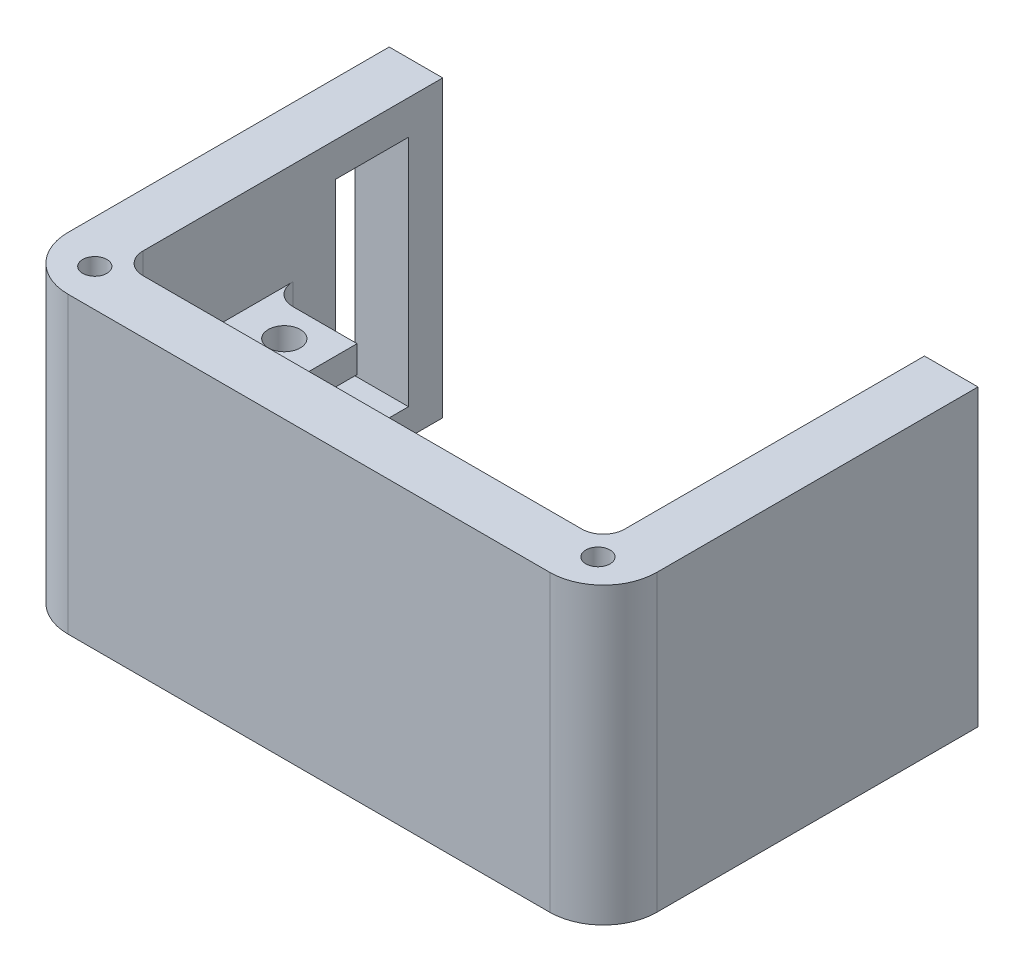
ISO-10303-21;
HEADER;
FILE_DESCRIPTION(('STEP AP214'),'2;1');
FILE_NAME('part.step','',(''),(''),'','','');
FILE_SCHEMA(('AUTOMOTIVE_DESIGN { 1 0 10303 214 1 1 1 1 }'));
ENDSEC;
DATA;
#1=APPLICATION_CONTEXT('core data for automotive mechanical design processes');
#2=APPLICATION_PROTOCOL_DEFINITION('international standard','automotive_design',2000,#1);
#3=PRODUCT_CONTEXT('',#1,'mechanical');
#4=PRODUCT('Part','Part','',(#3));
#5=PRODUCT_RELATED_PRODUCT_CATEGORY('part','',(#4));
#6=PRODUCT_DEFINITION_FORMATION('','',#4);
#7=PRODUCT_DEFINITION_CONTEXT('part definition',#1,'design');
#8=PRODUCT_DEFINITION('design','',#6,#7);
#9=PRODUCT_DEFINITION_SHAPE('','',#8);
#10=(LENGTH_UNIT() NAMED_UNIT(*) SI_UNIT(.MILLI.,.METRE.));
#11=(NAMED_UNIT(*) PLANE_ANGLE_UNIT() SI_UNIT($,.RADIAN.));
#12=(NAMED_UNIT(*) SI_UNIT($,.STERADIAN.) SOLID_ANGLE_UNIT());
#13=UNCERTAINTY_MEASURE_WITH_UNIT(LENGTH_MEASURE(1.E-05),#10,'distance_accuracy_value','');
#14=(GEOMETRIC_REPRESENTATION_CONTEXT(3) GLOBAL_UNCERTAINTY_ASSIGNED_CONTEXT((#13)) GLOBAL_UNIT_ASSIGNED_CONTEXT((#10,
#11,#12)) REPRESENTATION_CONTEXT('',''));
#15=CARTESIAN_POINT('',(0.,0.,0.));
#16=DIRECTION('',(0.,0.,1.));
#17=DIRECTION('',(1.,0.,0.));
#18=AXIS2_PLACEMENT_3D('',#15,#16,#17);
#19=CARTESIAN_POINT('',(28.575,31.75,0.));
#20=DIRECTION('',(1.,0.,0.));
#21=DIRECTION('',(0.,0.,-1.));
#22=AXIS2_PLACEMENT_3D('',#19,#20,#21);
#23=PLANE('',#22);
#24=DIRECTION('',(0.,0.,-1.));
#25=VECTOR('',#24,1.);
#26=CARTESIAN_POINT('',(28.575,-3.175,9.52500000000001));
#27=LINE('',#26,#25);
#28=CARTESIAN_POINT('',(28.575,-3.175,6.985));
#29=VERTEX_POINT('',#28);
#30=CARTESIAN_POINT('',(28.575,-3.175,-28.575));
#31=VERTEX_POINT('',#30);
#32=EDGE_CURVE('E299',#29,#31,#27,.T.);
#33=ORIENTED_EDGE('',*,*,#32,.F.);
#34=DIRECTION('',(0.,-1.,0.));
#35=VECTOR('',#34,1.);
#36=CARTESIAN_POINT('',(28.575,31.75,6.985));
#37=LINE('',#36,#35);
#38=CARTESIAN_POINT('',(28.575,31.75,6.985));
#39=VERTEX_POINT('',#38);
#40=EDGE_CURVE('E63',#29,#39,#37,.F.);
#41=ORIENTED_EDGE('',*,*,#40,.T.);
#42=DIRECTION('',(0.,0.,1.));
#43=VECTOR('',#42,1.);
#44=CARTESIAN_POINT('',(28.575,31.75,0.));
#45=LINE('',#44,#43);
#46=CARTESIAN_POINT('',(28.575,31.75,-28.575));
#47=VERTEX_POINT('',#46);
#48=EDGE_CURVE('E412',#47,#39,#45,.T.);
#49=ORIENTED_EDGE('',*,*,#48,.F.);
#50=DIRECTION('',(0.,-1.,0.));
#51=VECTOR('',#50,1.);
#52=CARTESIAN_POINT('',(28.575,31.75,-28.575));
#53=LINE('',#52,#51);
#54=EDGE_CURVE('E444',#47,#31,#53,.T.);
#55=ORIENTED_EDGE('',*,*,#54,.T.);
#56=EDGE_LOOP('',(#33,#41,#49,#55));
#57=FACE_BOUND('',#56,.T.);
#58=DIRECTION('',(0.,0.,-1.));
#59=VECTOR('',#58,1.);
#60=CARTESIAN_POINT('',(28.575,13.97,0.));
#61=LINE('',#60,#59);
#62=CARTESIAN_POINT('',(28.575,13.97,1.905));
#63=VERTEX_POINT('',#62);
#64=CARTESIAN_POINT('',(28.575,13.97,-10.795));
#65=VERTEX_POINT('',#64);
#66=EDGE_CURVE('E518',#63,#65,#61,.T.);
#67=ORIENTED_EDGE('',*,*,#66,.T.);
#68=DIRECTION('',(0.,1.,0.));
#69=VECTOR('',#68,1.);
#70=CARTESIAN_POINT('',(28.575,31.75,-10.795));
#71=LINE('',#70,#69);
#72=CARTESIAN_POINT('',(28.575,19.685,-10.795));
#73=VERTEX_POINT('',#72);
#74=EDGE_CURVE('E478',#65,#73,#71,.T.);
#75=ORIENTED_EDGE('',*,*,#74,.T.);
#76=DIRECTION('',(0.,0.,-1.));
#77=VECTOR('',#76,1.);
#78=CARTESIAN_POINT('',(28.575,19.685,-0.634999999999996));
#79=LINE('',#78,#77);
#80=CARTESIAN_POINT('',(28.575,19.685,1.905));
#81=VERTEX_POINT('',#80);
#82=EDGE_CURVE('E332',#81,#73,#79,.T.);
#83=ORIENTED_EDGE('',*,*,#82,.F.);
#84=DIRECTION('',(0.,1.,0.));
#85=VECTOR('',#84,1.);
#86=CARTESIAN_POINT('',(28.575,16.51,1.905));
#87=LINE('',#86,#85);
#88=EDGE_CURVE('E482',#81,#63,#87,.F.);
#89=ORIENTED_EDGE('',*,*,#88,.T.);
#90=EDGE_LOOP('',(#67,#75,#83,#89));
#91=FACE_BOUND('',#90,.T.);
#92=ADVANCED_FACE('F45',(#57,#91),#23,.F.);
#93=CARTESIAN_POINT('',(0.,31.75,-28.575));
#94=DIRECTION('',(0.,0.,1.));
#95=DIRECTION('',(1.,0.,0.));
#96=AXIS2_PLACEMENT_3D('',#93,#94,#95);
#97=PLANE('',#96);
#98=DIRECTION('',(0.,-1.,0.));
#99=VECTOR('',#98,1.);
#100=CARTESIAN_POINT('',(34.925,31.75,-28.575));
#101=LINE('',#100,#99);
#102=CARTESIAN_POINT('',(34.925,31.75,-28.575));
#103=VERTEX_POINT('',#102);
#104=CARTESIAN_POINT('',(34.925,-3.175,-28.575));
#105=VERTEX_POINT('',#104);
#106=EDGE_CURVE('E433',#103,#105,#101,.T.);
#107=ORIENTED_EDGE('',*,*,#106,.T.);
#108=DIRECTION('',(1.,0.,0.));
#109=VECTOR('',#108,1.);
#110=CARTESIAN_POINT('',(28.575,-3.175,-28.575));
#111=LINE('',#110,#109);
#112=EDGE_CURVE('E302',#31,#105,#111,.T.);
#113=ORIENTED_EDGE('',*,*,#112,.F.);
#114=ORIENTED_EDGE('',*,*,#54,.F.);
#115=DIRECTION('',(-1.,0.,0.));
#116=VECTOR('',#115,1.);
#117=CARTESIAN_POINT('',(0.,31.75,-28.575));
#118=LINE('',#117,#116);
#119=EDGE_CURVE('E408',#103,#47,#118,.T.);
#120=ORIENTED_EDGE('',*,*,#119,.F.);
#121=EDGE_LOOP('',(#107,#113,#114,#120));
#122=FACE_BOUND('',#121,.T.);
#123=ADVANCED_FACE('F635',(#122),#97,.F.);
#124=CARTESIAN_POINT('',(0.,31.75,9.52500000000001));
#125=DIRECTION('',(0.,0.,1.));
#126=DIRECTION('',(1.,0.,0.));
#127=AXIS2_PLACEMENT_3D('',#124,#125,#126);
#128=PLANE('',#127);
#129=DIRECTION('',(1.,0.,0.));
#130=VECTOR('',#129,1.);
#131=CARTESIAN_POINT('',(-28.575,-3.175,9.52500000000001));
#132=LINE('',#131,#130);
#133=CARTESIAN_POINT('',(-26.035,-3.175,9.52500000000001));
#134=VERTEX_POINT('',#133);
#135=CARTESIAN_POINT('',(26.035,-3.175,9.52500000000001));
#136=VERTEX_POINT('',#135);
#137=EDGE_CURVE('E296',#134,#136,#132,.T.);
#138=ORIENTED_EDGE('',*,*,#137,.F.);
#139=DIRECTION('',(0.,-1.,0.));
#140=VECTOR('',#139,1.);
#141=CARTESIAN_POINT('',(-26.035,31.75,9.52500000000001));
#142=LINE('',#141,#140);
#143=CARTESIAN_POINT('',(-26.035,31.75,9.52500000000001));
#144=VERTEX_POINT('',#143);
#145=EDGE_CURVE('E555',#134,#144,#142,.F.);
#146=ORIENTED_EDGE('',*,*,#145,.T.);
#147=DIRECTION('',(-1.,0.,0.));
#148=VECTOR('',#147,1.);
#149=CARTESIAN_POINT('',(0.,31.75,9.52500000000001));
#150=LINE('',#149,#148);
#151=CARTESIAN_POINT('',(26.035,31.75,9.52500000000001));
#152=VERTEX_POINT('',#151);
#153=EDGE_CURVE('E415',#152,#144,#150,.T.);
#154=ORIENTED_EDGE('',*,*,#153,.F.);
#155=DIRECTION('',(0.,-1.,0.));
#156=VECTOR('',#155,1.);
#157=CARTESIAN_POINT('',(26.035,-3.175,9.52500000000001));
#158=LINE('',#157,#156);
#159=EDGE_CURVE('E551',#152,#136,#158,.T.);
#160=ORIENTED_EDGE('',*,*,#159,.T.);
#161=EDGE_LOOP('',(#138,#146,#154,#160));
#162=FACE_BOUND('',#161,.T.);
#163=ADVANCED_FACE('F622',(#162),#128,.F.);
#164=CARTESIAN_POINT('',(-28.575,31.75,0.));
#165=DIRECTION('',(1.,0.,0.));
#166=DIRECTION('',(0.,0.,-1.));
#167=AXIS2_PLACEMENT_3D('',#164,#165,#166);
#168=PLANE('',#167);
#169=DIRECTION('',(0.,-1.,0.));
#170=VECTOR('',#169,1.);
#171=CARTESIAN_POINT('',(-28.575,31.75,-15.875));
#172=LINE('',#171,#170);
#173=CARTESIAN_POINT('',(-28.575,27.686,-15.875));
#174=VERTEX_POINT('',#173);
#175=CARTESIAN_POINT('',(-28.575,0.,-15.875));
#176=VERTEX_POINT('',#175);
#177=EDGE_CURVE('E238',#174,#176,#172,.T.);
#178=ORIENTED_EDGE('',*,*,#177,.F.);
#179=DIRECTION('',(0.,0.,1.));
#180=VECTOR('',#179,1.);
#181=CARTESIAN_POINT('',(-28.575,27.686,-24.511));
#182=LINE('',#181,#180);
#183=CARTESIAN_POINT('',(-28.575,27.686,-24.511));
#184=VERTEX_POINT('',#183);
#185=EDGE_CURVE('E230',#184,#174,#182,.T.);
#186=ORIENTED_EDGE('',*,*,#185,.F.);
#187=DIRECTION('',(0.,1.,0.));
#188=VECTOR('',#187,1.);
#189=CARTESIAN_POINT('',(-28.575,0.,-24.511));
#190=LINE('',#189,#188);
#191=CARTESIAN_POINT('',(-28.575,0.,-24.511));
#192=VERTEX_POINT('',#191);
#193=EDGE_CURVE('E236',#192,#184,#190,.T.);
#194=ORIENTED_EDGE('',*,*,#193,.F.);
#195=DIRECTION('',(0.,0.,1.));
#196=VECTOR('',#195,1.);
#197=CARTESIAN_POINT('',(-28.575,0.,-28.575));
#198=LINE('',#197,#196);
#199=EDGE_CURVE('E286',#192,#176,#198,.T.);
#200=ORIENTED_EDGE('',*,*,#199,.T.);
#201=EDGE_LOOP('',(#178,#186,#194,#200));
#202=FACE_BOUND('',#201,.T.);
#203=DIRECTION('',(0.,1.,0.));
#204=VECTOR('',#203,1.);
#205=CARTESIAN_POINT('',(-28.575,31.75,-10.795));
#206=LINE('',#205,#204);
#207=CARTESIAN_POINT('',(-28.575,19.685,-10.795));
#208=VERTEX_POINT('',#207);
#209=CARTESIAN_POINT('',(-28.575,13.97,-10.795));
#210=VERTEX_POINT('',#209);
#211=EDGE_CURVE('E489',#208,#210,#206,.F.);
#212=ORIENTED_EDGE('',*,*,#211,.T.);
#213=DIRECTION('',(0.,0.,-1.));
#214=VECTOR('',#213,1.);
#215=CARTESIAN_POINT('',(-28.575,13.97,0.));
#216=LINE('',#215,#214);
#217=CARTESIAN_POINT('',(-28.575,13.97,1.905));
#218=VERTEX_POINT('',#217);
#219=EDGE_CURVE('E529',#210,#218,#216,.F.);
#220=ORIENTED_EDGE('',*,*,#219,.T.);
#221=DIRECTION('',(0.,1.,0.));
#222=VECTOR('',#221,1.);
#223=CARTESIAN_POINT('',(-28.575,19.685,1.905));
#224=LINE('',#223,#222);
#225=CARTESIAN_POINT('',(-28.575,19.685,1.905));
#226=VERTEX_POINT('',#225);
#227=EDGE_CURVE('E492',#218,#226,#224,.T.);
#228=ORIENTED_EDGE('',*,*,#227,.T.);
#229=DIRECTION('',(0.,0.,-1.));
#230=VECTOR('',#229,1.);
#231=CARTESIAN_POINT('',(-28.575,19.685,-0.634999999999996));
#232=LINE('',#231,#230);
#233=EDGE_CURVE('E374',#226,#208,#232,.T.);
#234=ORIENTED_EDGE('',*,*,#233,.T.);
#235=EDGE_LOOP('',(#212,#220,#228,#234));
#236=FACE_BOUND('',#235,.T.);
#237=DIRECTION('',(0.,0.,1.));
#238=VECTOR('',#237,1.);
#239=CARTESIAN_POINT('',(-28.575,31.75,0.));
#240=LINE('',#239,#238);
#241=CARTESIAN_POINT('',(-28.575,31.75,-28.575));
#242=VERTEX_POINT('',#241);
#243=CARTESIAN_POINT('',(-28.575,31.75,6.98500000000001));
#244=VERTEX_POINT('',#243);
#245=EDGE_CURVE('E419',#242,#244,#240,.T.);
#246=ORIENTED_EDGE('',*,*,#245,.T.);
#247=DIRECTION('',(0.,-1.,0.));
#248=VECTOR('',#247,1.);
#249=CARTESIAN_POINT('',(-28.575,31.75,6.98500000000001));
#250=LINE('',#249,#248);
#251=CARTESIAN_POINT('',(-28.575,-3.175,6.98500000000001));
#252=VERTEX_POINT('',#251);
#253=EDGE_CURVE('E547',#244,#252,#250,.T.);
#254=ORIENTED_EDGE('',*,*,#253,.T.);
#255=DIRECTION('',(0.,0.,1.));
#256=VECTOR('',#255,1.);
#257=CARTESIAN_POINT('',(-28.575,-3.175,-28.575));
#258=LINE('',#257,#256);
#259=CARTESIAN_POINT('',(-28.575,-3.175,-28.575));
#260=VERTEX_POINT('',#259);
#261=EDGE_CURVE('E292',#260,#252,#258,.T.);
#262=ORIENTED_EDGE('',*,*,#261,.F.);
#263=DIRECTION('',(0.,1.,0.));
#264=VECTOR('',#263,1.);
#265=CARTESIAN_POINT('',(-28.575,-3.175,-28.575));
#266=LINE('',#265,#264);
#267=EDGE_CURVE('E310',#260,#242,#266,.T.);
#268=ORIENTED_EDGE('',*,*,#267,.T.);
#269=EDGE_LOOP('',(#246,#254,#262,#268));
#270=FACE_BOUND('',#269,.T.);
#271=ADVANCED_FACE('F232',(#202,#236,#270),#168,.T.);
#272=CARTESIAN_POINT('',(0.,31.75,-15.875));
#273=DIRECTION('',(0.,0.,1.));
#274=DIRECTION('',(1.,0.,0.));
#275=AXIS2_PLACEMENT_3D('',#272,#273,#274);
#276=PLANE('',#275);
#277=DIRECTION('',(0.,-1.,0.));
#278=VECTOR('',#277,1.);
#279=CARTESIAN_POINT('',(-34.925,31.75,-15.875));
#280=LINE('',#279,#278);
#281=CARTESIAN_POINT('',(-34.925,27.686,-15.875));
#282=VERTEX_POINT('',#281);
#283=CARTESIAN_POINT('',(-34.925,0.,-15.875));
#284=VERTEX_POINT('',#283);
#285=EDGE_CURVE('E439',#282,#284,#280,.T.);
#286=ORIENTED_EDGE('',*,*,#285,.F.);
#287=DIRECTION('',(-1.,0.,0.));
#288=VECTOR('',#287,1.);
#289=CARTESIAN_POINT('',(5.6207965253041,27.686,-15.875));
#290=LINE('',#289,#288);
#291=EDGE_CURVE('E242',#174,#282,#290,.T.);
#292=ORIENTED_EDGE('',*,*,#291,.F.);
#293=ORIENTED_EDGE('',*,*,#177,.T.);
#294=DIRECTION('',(-1.,0.,0.));
#295=VECTOR('',#294,1.);
#296=CARTESIAN_POINT('',(0.,0.,-15.875));
#297=LINE('',#296,#295);
#298=EDGE_CURVE('E396',#176,#284,#297,.T.);
#299=ORIENTED_EDGE('',*,*,#298,.T.);
#300=EDGE_LOOP('',(#286,#292,#293,#299));
#301=FACE_BOUND('',#300,.T.);
#302=ADVANCED_FACE('F720',(#301),#276,.F.);
#303=CARTESIAN_POINT('',(-34.925,31.75,0.));
#304=DIRECTION('',(-1.,0.,0.));
#305=DIRECTION('',(0.,0.,1.));
#306=AXIS2_PLACEMENT_3D('',#303,#304,#305);
#307=PLANE('',#306);
#308=DIRECTION('',(0.,0.,1.));
#309=VECTOR('',#308,1.);
#310=CARTESIAN_POINT('',(-34.925,27.686,-24.511));
#311=LINE('',#310,#309);
#312=CARTESIAN_POINT('',(-34.925,27.686,-24.511));
#313=VERTEX_POINT('',#312);
#314=EDGE_CURVE('E248',#313,#282,#311,.T.);
#315=ORIENTED_EDGE('',*,*,#314,.T.);
#316=ORIENTED_EDGE('',*,*,#285,.T.);
#317=DIRECTION('',(0.,0.,-1.));
#318=VECTOR('',#317,1.);
#319=CARTESIAN_POINT('',(-34.925,0.,15.875));
#320=LINE('',#319,#318);
#321=CARTESIAN_POINT('',(-34.925,0.,-24.511));
#322=VERTEX_POINT('',#321);
#323=EDGE_CURVE('E311',#284,#322,#320,.T.);
#324=ORIENTED_EDGE('',*,*,#323,.T.);
#325=DIRECTION('',(0.,1.,0.));
#326=VECTOR('',#325,1.);
#327=CARTESIAN_POINT('',(-34.925,0.,-24.511));
#328=LINE('',#327,#326);
#329=EDGE_CURVE('E260',#322,#313,#328,.T.);
#330=ORIENTED_EDGE('',*,*,#329,.T.);
#331=EDGE_LOOP('',(#315,#316,#324,#330));
#332=FACE_BOUND('',#331,.T.);
#333=DIRECTION('',(0.,0.,-1.));
#334=VECTOR('',#333,1.);
#335=CARTESIAN_POINT('',(-34.925,-3.175,15.875));
#336=LINE('',#335,#334);
#337=CARTESIAN_POINT('',(-34.925,-3.175,9.525));
#338=VERTEX_POINT('',#337);
#339=CARTESIAN_POINT('',(-34.925,-3.175,-28.575));
#340=VERTEX_POINT('',#339);
#341=EDGE_CURVE('E285',#338,#340,#336,.T.);
#342=ORIENTED_EDGE('',*,*,#341,.F.);
#343=DIRECTION('',(0.,-1.,0.));
#344=VECTOR('',#343,1.);
#345=CARTESIAN_POINT('',(-34.925,31.75,9.525));
#346=LINE('',#345,#344);
#347=CARTESIAN_POINT('',(-34.925,31.75,9.525));
#348=VERTEX_POINT('',#347);
#349=EDGE_CURVE('E471',#338,#348,#346,.F.);
#350=ORIENTED_EDGE('',*,*,#349,.T.);
#351=DIRECTION('',(0.,0.,-1.));
#352=VECTOR('',#351,1.);
#353=CARTESIAN_POINT('',(-34.925,31.75,0.));
#354=LINE('',#353,#352);
#355=CARTESIAN_POINT('',(-34.925,31.75,-28.575));
#356=VERTEX_POINT('',#355);
#357=EDGE_CURVE('E423',#348,#356,#354,.T.);
#358=ORIENTED_EDGE('',*,*,#357,.T.);
#359=DIRECTION('',(0.,1.,0.));
#360=VECTOR('',#359,1.);
#361=CARTESIAN_POINT('',(-34.925,-3.175,-28.575));
#362=LINE('',#361,#360);
#363=EDGE_CURVE('E320',#340,#356,#362,.T.);
#364=ORIENTED_EDGE('',*,*,#363,.F.);
#365=EDGE_LOOP('',(#342,#350,#358,#364));
#366=FACE_BOUND('',#365,.T.);
#367=ADVANCED_FACE('F607',(#332,#366),#307,.T.);
#368=CARTESIAN_POINT('',(0.,31.75,15.875));
#369=DIRECTION('',(0.,0.,-1.));
#370=DIRECTION('',(-1.,0.,0.));
#371=AXIS2_PLACEMENT_3D('',#368,#369,#370);
#372=PLANE('',#371);
#373=DIRECTION('',(-1.,0.,0.));
#374=VECTOR('',#373,1.);
#375=CARTESIAN_POINT('',(34.925,-3.175,15.875));
#376=LINE('',#375,#374);
#377=CARTESIAN_POINT('',(28.575,-3.175,15.875));
#378=VERTEX_POINT('',#377);
#379=CARTESIAN_POINT('',(-28.575,-3.175,15.875));
#380=VERTEX_POINT('',#379);
#381=EDGE_CURVE('E281',#378,#380,#376,.T.);
#382=ORIENTED_EDGE('',*,*,#381,.F.);
#383=DIRECTION('',(0.,-1.,0.));
#384=VECTOR('',#383,1.);
#385=CARTESIAN_POINT('',(28.575,31.75,15.875));
#386=LINE('',#385,#384);
#387=CARTESIAN_POINT('',(28.575,31.75,15.875));
#388=VERTEX_POINT('',#387);
#389=EDGE_CURVE('E462',#378,#388,#386,.F.);
#390=ORIENTED_EDGE('',*,*,#389,.T.);
#391=DIRECTION('',(1.,0.,0.));
#392=VECTOR('',#391,1.);
#393=CARTESIAN_POINT('',(0.,31.75,15.875));
#394=LINE('',#393,#392);
#395=CARTESIAN_POINT('',(-28.575,31.75,15.875));
#396=VERTEX_POINT('',#395);
#397=EDGE_CURVE('E426',#396,#388,#394,.T.);
#398=ORIENTED_EDGE('',*,*,#397,.F.);
#399=DIRECTION('',(0.,-1.,0.));
#400=VECTOR('',#399,1.);
#401=CARTESIAN_POINT('',(-28.575,-3.175,15.875));
#402=LINE('',#401,#400);
#403=EDGE_CURVE('E458',#396,#380,#402,.T.);
#404=ORIENTED_EDGE('',*,*,#403,.T.);
#405=EDGE_LOOP('',(#382,#390,#398,#404));
#406=FACE_BOUND('',#405,.T.);
#407=ADVANCED_FACE('F595',(#406),#372,.F.);
#408=CARTESIAN_POINT('',(34.925,31.75,0.));
#409=DIRECTION('',(-1.,0.,0.));
#410=DIRECTION('',(0.,0.,1.));
#411=AXIS2_PLACEMENT_3D('',#408,#409,#410);
#412=PLANE('',#411);
#413=DIRECTION('',(0.,0.,-1.));
#414=VECTOR('',#413,1.);
#415=CARTESIAN_POINT('',(34.925,31.75,0.));
#416=LINE('',#415,#414);
#417=CARTESIAN_POINT('',(34.925,31.75,9.525));
#418=VERTEX_POINT('',#417);
#419=EDGE_CURVE('E430',#418,#103,#416,.T.);
#420=ORIENTED_EDGE('',*,*,#419,.F.);
#421=DIRECTION('',(0.,-1.,0.));
#422=VECTOR('',#421,1.);
#423=CARTESIAN_POINT('',(34.925,31.75,9.525));
#424=LINE('',#423,#422);
#425=CARTESIAN_POINT('',(34.925,-3.175,9.525));
#426=VERTEX_POINT('',#425);
#427=EDGE_CURVE('E448',#418,#426,#424,.T.);
#428=ORIENTED_EDGE('',*,*,#427,.T.);
#429=DIRECTION('',(0.,0.,1.));
#430=VECTOR('',#429,1.);
#431=CARTESIAN_POINT('',(34.925,-3.175,-28.575));
#432=LINE('',#431,#430);
#433=EDGE_CURVE('E306',#105,#426,#432,.T.);
#434=ORIENTED_EDGE('',*,*,#433,.F.);
#435=ORIENTED_EDGE('',*,*,#106,.F.);
#436=EDGE_LOOP('',(#420,#428,#434,#435));
#437=FACE_BOUND('',#436,.T.);
#438=ADVANCED_FACE('F586',(#437),#412,.F.);
#439=CARTESIAN_POINT('',(0.,31.75,0.));
#440=DIRECTION('',(0.,1.,0.));
#441=DIRECTION('',(0.,0.,1.));
#442=AXIS2_PLACEMENT_3D('',#439,#440,#441);
#443=PLANE('',#442);
#444=CARTESIAN_POINT('',(29.845,31.75,11.43));
#445=DIRECTION('',(0.,1.,0.));
#446=DIRECTION('',(0.,0.,1.));
#447=AXIS2_PLACEMENT_3D('',#444,#445,#446);
#448=CIRCLE('',#447,1.43509999999999);
#449=CARTESIAN_POINT('',(29.845,31.75,12.8651));
#450=VERTEX_POINT('',#449);
#451=EDGE_CURVE('E272',#450,#450,#448,.T.);
#452=ORIENTED_EDGE('',*,*,#451,.F.);
#453=EDGE_LOOP('',(#452));
#454=FACE_BOUND('',#453,.T.);
#455=CARTESIAN_POINT('',(-29.845,31.75,11.43));
#456=DIRECTION('',(0.,1.,0.));
#457=DIRECTION('',(0.,0.,1.));
#458=AXIS2_PLACEMENT_3D('',#455,#456,#457);
#459=CIRCLE('',#458,1.43509999999999);
#460=CARTESIAN_POINT('',(-29.845,31.75,12.8651));
#461=VERTEX_POINT('',#460);
#462=EDGE_CURVE('E276',#461,#461,#459,.T.);
#463=ORIENTED_EDGE('',*,*,#462,.F.);
#464=EDGE_LOOP('',(#463));
#465=FACE_BOUND('',#464,.T.);
#466=ORIENTED_EDGE('',*,*,#397,.T.);
#467=CARTESIAN_POINT('',(28.575,31.75,9.525));
#468=DIRECTION('',(0.,1.,0.));
#469=DIRECTION('',(0.,0.,1.));
#470=AXIS2_PLACEMENT_3D('',#467,#468,#469);
#471=CIRCLE('',#470,6.35);
#472=EDGE_CURVE('E468',#388,#418,#471,.T.);
#473=ORIENTED_EDGE('',*,*,#472,.T.);
#474=ORIENTED_EDGE('',*,*,#419,.T.);
#475=ORIENTED_EDGE('',*,*,#119,.T.);
#476=ORIENTED_EDGE('',*,*,#48,.T.);
#477=CARTESIAN_POINT('',(26.035,31.75,6.985));
#478=DIRECTION('',(0.,1.,0.));
#479=DIRECTION('',(0.,0.,1.));
#480=AXIS2_PLACEMENT_3D('',#477,#478,#479);
#481=CIRCLE('',#480,2.54);
#482=EDGE_CURVE('E11',#39,#152,#481,.F.);
#483=ORIENTED_EDGE('',*,*,#482,.T.);
#484=ORIENTED_EDGE('',*,*,#153,.T.);
#485=CARTESIAN_POINT('',(-26.035,31.75,6.98500000000001));
#486=DIRECTION('',(0.,1.,0.));
#487=DIRECTION('',(0.,0.,1.));
#488=AXIS2_PLACEMENT_3D('',#485,#486,#487);
#489=CIRCLE('',#488,2.54);
#490=EDGE_CURVE('E563',#144,#244,#489,.F.);
#491=ORIENTED_EDGE('',*,*,#490,.T.);
#492=ORIENTED_EDGE('',*,*,#245,.F.);
#493=DIRECTION('',(-1.,0.,0.));
#494=VECTOR('',#493,1.);
#495=CARTESIAN_POINT('',(5.6207965253041,31.75,-28.575));
#496=LINE('',#495,#494);
#497=EDGE_CURVE('E264',#242,#356,#496,.T.);
#498=ORIENTED_EDGE('',*,*,#497,.T.);
#499=ORIENTED_EDGE('',*,*,#357,.F.);
#500=CARTESIAN_POINT('',(-28.575,31.75,9.525));
#501=DIRECTION('',(0.,1.,0.));
#502=DIRECTION('',(0.,0.,1.));
#503=AXIS2_PLACEMENT_3D('',#500,#501,#502);
#504=CIRCLE('',#503,6.35);
#505=EDGE_CURVE('E465',#348,#396,#504,.T.);
#506=ORIENTED_EDGE('',*,*,#505,.T.);
#507=EDGE_LOOP('',(#466,#473,#474,#475,#476,#483,#484,#491,#492,#498,#499,#506));
#508=FACE_BOUND('',#507,.T.);
#509=ADVANCED_FACE('F598',(#454,#465,#508),#443,.T.);
#510=CARTESIAN_POINT('',(-18.415,16.51,-0.634999999999996));
#511=DIRECTION('',(0.,0.,1.));
#512=DIRECTION('',(1.,0.,0.));
#513=AXIS2_PLACEMENT_3D('',#510,#511,#512);
#514=PLANE('',#513);
#515=DIRECTION('',(-1.,0.,0.));
#516=VECTOR('',#515,1.);
#517=CARTESIAN_POINT('',(-18.415,19.685,-0.634999999999996));
#518=LINE('',#517,#516);
#519=CARTESIAN_POINT('',(-18.415,19.685,-0.634999999999996));
#520=VERTEX_POINT('',#519);
#521=CARTESIAN_POINT('',(-26.035,19.685,-0.634999999999996));
#522=VERTEX_POINT('',#521);
#523=EDGE_CURVE('E389',#520,#522,#518,.T.);
#524=ORIENTED_EDGE('',*,*,#523,.T.);
#525=DIRECTION('',(0.,1.,0.));
#526=VECTOR('',#525,1.);
#527=CARTESIAN_POINT('',(-26.035,16.51,-0.634999999999996));
#528=LINE('',#527,#526);
#529=CARTESIAN_POINT('',(-26.035,16.51,-0.634999999999996));
#530=VERTEX_POINT('',#529);
#531=EDGE_CURVE('E496',#522,#530,#528,.F.);
#532=ORIENTED_EDGE('',*,*,#531,.T.);
#533=DIRECTION('',(-1.,0.,0.));
#534=VECTOR('',#533,1.);
#535=CARTESIAN_POINT('',(-18.415,16.51,-0.634999999999996));
#536=LINE('',#535,#534);
#537=CARTESIAN_POINT('',(-18.415,16.51,-0.634999999999996));
#538=VERTEX_POINT('',#537);
#539=EDGE_CURVE('E392',#538,#530,#536,.T.);
#540=ORIENTED_EDGE('',*,*,#539,.F.);
#541=DIRECTION('',(0.,1.,0.));
#542=VECTOR('',#541,1.);
#543=CARTESIAN_POINT('',(-18.415,16.51,-0.634999999999996));
#544=LINE('',#543,#542);
#545=EDGE_CURVE('E375',#538,#520,#544,.T.);
#546=ORIENTED_EDGE('',*,*,#545,.T.);
#547=EDGE_LOOP('',(#524,#532,#540,#546));
#548=FACE_BOUND('',#547,.T.);
#549=ADVANCED_FACE('F680',(#548),#514,.T.);
#550=CARTESIAN_POINT('',(-18.415,16.51,-0.634999999999996));
#551=DIRECTION('',(0.,1.,0.));
#552=DIRECTION('',(0.,0.,1.));
#553=AXIS2_PLACEMENT_3D('',#550,#551,#552);
#554=PLANE('',#553);
#555=CARTESIAN_POINT('',(-23.241,16.51,-4.445));
#556=DIRECTION('',(0.,1.,0.));
#557=DIRECTION('',(0.,0.,1.));
#558=AXIS2_PLACEMENT_3D('',#555,#556,#557);
#559=CIRCLE('',#558,1.89865);
#560=CARTESIAN_POINT('',(-23.241,16.51,-2.54635));
#561=VERTEX_POINT('',#560);
#562=EDGE_CURVE('E370',#561,#561,#559,.T.);
#563=ORIENTED_EDGE('',*,*,#562,.T.);
#564=EDGE_LOOP('',(#563));
#565=FACE_BOUND('',#564,.T.);
#566=ORIENTED_EDGE('',*,*,#539,.T.);
#567=DIRECTION('',(0.,0.,-1.));
#568=VECTOR('',#567,1.);
#569=CARTESIAN_POINT('',(-26.035,16.51,-0.634999999999996));
#570=LINE('',#569,#568);
#571=CARTESIAN_POINT('',(-26.035,16.51,-8.255));
#572=VERTEX_POINT('',#571);
#573=EDGE_CURVE('E525',#530,#572,#570,.T.);
#574=ORIENTED_EDGE('',*,*,#573,.T.);
#575=DIRECTION('',(-1.,0.,0.));
#576=VECTOR('',#575,1.);
#577=CARTESIAN_POINT('',(-18.415,16.51,-8.255));
#578=LINE('',#577,#576);
#579=CARTESIAN_POINT('',(-18.415,16.51,-8.255));
#580=VERTEX_POINT('',#579);
#581=EDGE_CURVE('E397',#580,#572,#578,.T.);
#582=ORIENTED_EDGE('',*,*,#581,.F.);
#583=DIRECTION('',(0.,0.,-1.));
#584=VECTOR('',#583,1.);
#585=CARTESIAN_POINT('',(-18.415,16.51,-0.634999999999996));
#586=LINE('',#585,#584);
#587=EDGE_CURVE('E386',#538,#580,#586,.T.);
#588=ORIENTED_EDGE('',*,*,#587,.F.);
#589=EDGE_LOOP('',(#566,#574,#582,#588));
#590=FACE_BOUND('',#589,.T.);
#591=ADVANCED_FACE('F683',(#565,#590),#554,.F.);
#592=CARTESIAN_POINT('',(-18.415,16.51,-8.255));
#593=DIRECTION('',(0.,0.,1.));
#594=DIRECTION('',(1.,0.,0.));
#595=AXIS2_PLACEMENT_3D('',#592,#593,#594);
#596=PLANE('',#595);
#597=ORIENTED_EDGE('',*,*,#581,.T.);
#598=DIRECTION('',(0.,1.,0.));
#599=VECTOR('',#598,1.);
#600=CARTESIAN_POINT('',(-26.035,16.51,-8.255));
#601=LINE('',#600,#599);
#602=CARTESIAN_POINT('',(-26.035,19.685,-8.255));
#603=VERTEX_POINT('',#602);
#604=EDGE_CURVE('E500',#572,#603,#601,.T.);
#605=ORIENTED_EDGE('',*,*,#604,.T.);
#606=DIRECTION('',(-1.,0.,0.));
#607=VECTOR('',#606,1.);
#608=CARTESIAN_POINT('',(-18.415,19.685,-8.255));
#609=LINE('',#608,#607);
#610=CARTESIAN_POINT('',(-18.415,19.685,-8.255));
#611=VERTEX_POINT('',#610);
#612=EDGE_CURVE('E401',#611,#603,#609,.T.);
#613=ORIENTED_EDGE('',*,*,#612,.F.);
#614=DIRECTION('',(0.,1.,0.));
#615=VECTOR('',#614,1.);
#616=CARTESIAN_POINT('',(-18.415,16.51,-8.255));
#617=LINE('',#616,#615);
#618=EDGE_CURVE('E383',#580,#611,#617,.T.);
#619=ORIENTED_EDGE('',*,*,#618,.F.);
#620=EDGE_LOOP('',(#597,#605,#613,#619));
#621=FACE_BOUND('',#620,.T.);
#622=ADVANCED_FACE('F696',(#621),#596,.F.);
#623=CARTESIAN_POINT('',(-18.415,19.685,-0.634999999999996));
#624=DIRECTION('',(0.,1.,0.));
#625=DIRECTION('',(0.,0.,1.));
#626=AXIS2_PLACEMENT_3D('',#623,#624,#625);
#627=PLANE('',#626);
#628=CARTESIAN_POINT('',(-23.241,19.685,-4.445));
#629=DIRECTION('',(0.,1.,0.));
#630=DIRECTION('',(0.,0.,1.));
#631=AXIS2_PLACEMENT_3D('',#628,#629,#630);
#632=CIRCLE('',#631,1.89865);
#633=CARTESIAN_POINT('',(-23.241,19.685,-2.54635));
#634=VERTEX_POINT('',#633);
#635=EDGE_CURVE('E355',#634,#634,#632,.T.);
#636=ORIENTED_EDGE('',*,*,#635,.F.);
#637=EDGE_LOOP('',(#636));
#638=FACE_BOUND('',#637,.T.);
#639=ORIENTED_EDGE('',*,*,#233,.F.);
#640=CARTESIAN_POINT('',(-26.035,19.685,1.905));
#641=DIRECTION('',(0.,1.,0.));
#642=DIRECTION('',(0.,0.,1.));
#643=AXIS2_PLACEMENT_3D('',#640,#641,#642);
#644=CIRCLE('',#643,2.54);
#645=EDGE_CURVE('E511',#226,#522,#644,.F.);
#646=ORIENTED_EDGE('',*,*,#645,.T.);
#647=ORIENTED_EDGE('',*,*,#523,.F.);
#648=DIRECTION('',(0.,0.,-1.));
#649=VECTOR('',#648,1.);
#650=CARTESIAN_POINT('',(-18.415,19.685,-0.634999999999996));
#651=LINE('',#650,#649);
#652=EDGE_CURVE('E379',#520,#611,#651,.T.);
#653=ORIENTED_EDGE('',*,*,#652,.T.);
#654=ORIENTED_EDGE('',*,*,#612,.T.);
#655=CARTESIAN_POINT('',(-26.035,19.685,-10.795));
#656=DIRECTION('',(0.,1.,0.));
#657=DIRECTION('',(0.,0.,1.));
#658=AXIS2_PLACEMENT_3D('',#655,#656,#657);
#659=CIRCLE('',#658,2.54);
#660=EDGE_CURVE('E514',#603,#208,#659,.F.);
#661=ORIENTED_EDGE('',*,*,#660,.T.);
#662=EDGE_LOOP('',(#639,#646,#647,#653,#654,#661));
#663=FACE_BOUND('',#662,.T.);
#664=ADVANCED_FACE('F692',(#638,#663),#627,.T.);
#665=CARTESIAN_POINT('',(-18.415,0.,0.));
#666=DIRECTION('',(-1.,0.,0.));
#667=DIRECTION('',(0.,0.,1.));
#668=AXIS2_PLACEMENT_3D('',#665,#666,#667);
#669=PLANE('',#668);
#670=ORIENTED_EDGE('',*,*,#545,.F.);
#671=ORIENTED_EDGE('',*,*,#587,.T.);
#672=ORIENTED_EDGE('',*,*,#618,.T.);
#673=ORIENTED_EDGE('',*,*,#652,.F.);
#674=EDGE_LOOP('',(#670,#671,#672,#673));
#675=FACE_BOUND('',#674,.T.);
#676=ADVANCED_FACE('F689',(#675),#669,.F.);
#677=CARTESIAN_POINT('',(-23.241,19.685,-4.445));
#678=DIRECTION('',(0.,1.,0.));
#679=DIRECTION('',(0.,0.,1.));
#680=AXIS2_PLACEMENT_3D('',#677,#678,#679);
#681=CYLINDRICAL_SURFACE('',#680,1.89865);
#682=ORIENTED_EDGE('',*,*,#562,.F.);
#683=EDGE_LOOP('',(#682));
#684=FACE_BOUND('',#683,.T.);
#685=ORIENTED_EDGE('',*,*,#635,.T.);
#686=EDGE_LOOP('',(#685));
#687=FACE_BOUND('',#686,.T.);
#688=ADVANCED_FACE('F822',(#684,#687),#681,.F.);
#689=CARTESIAN_POINT('',(18.415,16.51,-0.634999999999996));
#690=DIRECTION('',(0.,0.,-1.));
#691=DIRECTION('',(-1.,0.,0.));
#692=AXIS2_PLACEMENT_3D('',#689,#690,#691);
#693=PLANE('',#692);
#694=DIRECTION('',(1.,0.,0.));
#695=VECTOR('',#694,1.);
#696=CARTESIAN_POINT('',(18.415,16.51,-0.634999999999996));
#697=LINE('',#696,#695);
#698=CARTESIAN_POINT('',(18.415,16.51,-0.634999999999996));
#699=VERTEX_POINT('',#698);
#700=CARTESIAN_POINT('',(26.035,16.51,-0.634999999999996));
#701=VERTEX_POINT('',#700);
#702=EDGE_CURVE('E348',#699,#701,#697,.T.);
#703=ORIENTED_EDGE('',*,*,#702,.T.);
#704=DIRECTION('',(0.,1.,0.));
#705=VECTOR('',#704,1.);
#706=CARTESIAN_POINT('',(26.035,19.685,-0.634999999999996));
#707=LINE('',#706,#705);
#708=CARTESIAN_POINT('',(26.035,19.685,-0.634999999999996));
#709=VERTEX_POINT('',#708);
#710=EDGE_CURVE('E474',#701,#709,#707,.T.);
#711=ORIENTED_EDGE('',*,*,#710,.T.);
#712=DIRECTION('',(1.,0.,0.));
#713=VECTOR('',#712,1.);
#714=CARTESIAN_POINT('',(18.415,19.685,-0.634999999999996));
#715=LINE('',#714,#713);
#716=CARTESIAN_POINT('',(18.415,19.685,-0.634999999999996));
#717=VERTEX_POINT('',#716);
#718=EDGE_CURVE('E351',#717,#709,#715,.T.);
#719=ORIENTED_EDGE('',*,*,#718,.F.);
#720=DIRECTION('',(0.,1.,0.));
#721=VECTOR('',#720,1.);
#722=CARTESIAN_POINT('',(18.415,16.51,-0.634999999999996));
#723=LINE('',#722,#721);
#724=EDGE_CURVE('E333',#699,#717,#723,.T.);
#725=ORIENTED_EDGE('',*,*,#724,.F.);
#726=EDGE_LOOP('',(#703,#711,#719,#725));
#727=FACE_BOUND('',#726,.T.);
#728=ADVANCED_FACE('F794',(#727),#693,.F.);
#729=CARTESIAN_POINT('',(18.415,19.685,-0.634999999999996));
#730=DIRECTION('',(0.,-1.,0.));
#731=DIRECTION('',(0.,0.,-1.));
#732=AXIS2_PLACEMENT_3D('',#729,#730,#731);
#733=PLANE('',#732);
#734=CARTESIAN_POINT('',(23.241,19.685,-4.445));
#735=DIRECTION('',(0.,1.,0.));
#736=DIRECTION('',(0.,0.,1.));
#737=AXIS2_PLACEMENT_3D('',#734,#735,#736);
#738=CIRCLE('',#737,1.89865);
#739=CARTESIAN_POINT('',(23.241,19.685,-2.54635));
#740=VERTEX_POINT('',#739);
#741=EDGE_CURVE('E324',#740,#740,#738,.T.);
#742=ORIENTED_EDGE('',*,*,#741,.F.);
#743=EDGE_LOOP('',(#742));
#744=FACE_BOUND('',#743,.T.);
#745=ORIENTED_EDGE('',*,*,#82,.T.);
#746=CARTESIAN_POINT('',(26.035,19.685,-10.795));
#747=DIRECTION('',(0.,-1.,0.));
#748=DIRECTION('',(0.,0.,-1.));
#749=AXIS2_PLACEMENT_3D('',#746,#747,#748);
#750=CIRCLE('',#749,2.54);
#751=CARTESIAN_POINT('',(26.035,19.685,-8.255));
#752=VERTEX_POINT('',#751);
#753=EDGE_CURVE('E508',#73,#752,#750,.T.);
#754=ORIENTED_EDGE('',*,*,#753,.T.);
#755=DIRECTION('',(1.,0.,0.));
#756=VECTOR('',#755,1.);
#757=CARTESIAN_POINT('',(18.415,19.685,-8.255));
#758=LINE('',#757,#756);
#759=CARTESIAN_POINT('',(18.415,19.685,-8.255));
#760=VERTEX_POINT('',#759);
#761=EDGE_CURVE('E356',#760,#752,#758,.T.);
#762=ORIENTED_EDGE('',*,*,#761,.F.);
#763=DIRECTION('',(0.,0.,-1.));
#764=VECTOR('',#763,1.);
#765=CARTESIAN_POINT('',(18.415,19.685,-0.634999999999996));
#766=LINE('',#765,#764);
#767=EDGE_CURVE('E345',#717,#760,#766,.T.);
#768=ORIENTED_EDGE('',*,*,#767,.F.);
#769=ORIENTED_EDGE('',*,*,#718,.T.);
#770=CARTESIAN_POINT('',(26.035,19.685,1.905));
#771=DIRECTION('',(0.,-1.,0.));
#772=DIRECTION('',(0.,0.,-1.));
#773=AXIS2_PLACEMENT_3D('',#770,#771,#772);
#774=CIRCLE('',#773,2.54);
#775=EDGE_CURVE('E504',#709,#81,#774,.T.);
#776=ORIENTED_EDGE('',*,*,#775,.T.);
#777=EDGE_LOOP('',(#745,#754,#762,#768,#769,#776));
#778=FACE_BOUND('',#777,.T.);
#779=ADVANCED_FACE('F788',(#744,#778),#733,.F.);
#780=CARTESIAN_POINT('',(18.415,16.51,-8.255));
#781=DIRECTION('',(0.,0.,-1.));
#782=DIRECTION('',(-1.,0.,0.));
#783=AXIS2_PLACEMENT_3D('',#780,#781,#782);
#784=PLANE('',#783);
#785=ORIENTED_EDGE('',*,*,#761,.T.);
#786=DIRECTION('',(0.,1.,0.));
#787=VECTOR('',#786,1.);
#788=CARTESIAN_POINT('',(26.035,16.51,-8.255));
#789=LINE('',#788,#787);
#790=CARTESIAN_POINT('',(26.035,16.51,-8.255));
#791=VERTEX_POINT('',#790);
#792=EDGE_CURVE('E485',#752,#791,#789,.F.);
#793=ORIENTED_EDGE('',*,*,#792,.T.);
#794=DIRECTION('',(1.,0.,0.));
#795=VECTOR('',#794,1.);
#796=CARTESIAN_POINT('',(18.415,16.51,-8.255));
#797=LINE('',#796,#795);
#798=CARTESIAN_POINT('',(18.415,16.51,-8.255));
#799=VERTEX_POINT('',#798);
#800=EDGE_CURVE('E360',#799,#791,#797,.T.);
#801=ORIENTED_EDGE('',*,*,#800,.F.);
#802=DIRECTION('',(0.,1.,0.));
#803=VECTOR('',#802,1.);
#804=CARTESIAN_POINT('',(18.415,16.51,-8.255));
#805=LINE('',#804,#803);
#806=EDGE_CURVE('E341',#799,#760,#805,.T.);
#807=ORIENTED_EDGE('',*,*,#806,.T.);
#808=EDGE_LOOP('',(#785,#793,#801,#807));
#809=FACE_BOUND('',#808,.T.);
#810=ADVANCED_FACE('F793',(#809),#784,.T.);
#811=CARTESIAN_POINT('',(18.415,16.51,-0.634999999999996));
#812=DIRECTION('',(0.,-1.,0.));
#813=DIRECTION('',(0.,0.,-1.));
#814=AXIS2_PLACEMENT_3D('',#811,#812,#813);
#815=PLANE('',#814);
#816=CARTESIAN_POINT('',(23.241,16.51,-4.445));
#817=DIRECTION('',(0.,-1.,0.));
#818=DIRECTION('',(0.,0.,-1.));
#819=AXIS2_PLACEMENT_3D('',#816,#817,#818);
#820=CIRCLE('',#819,1.89865);
#821=CARTESIAN_POINT('',(23.241,16.51,-6.34365));
#822=VERTEX_POINT('',#821);
#823=EDGE_CURVE('E328',#822,#822,#820,.T.);
#824=ORIENTED_EDGE('',*,*,#823,.F.);
#825=EDGE_LOOP('',(#824));
#826=FACE_BOUND('',#825,.T.);
#827=ORIENTED_EDGE('',*,*,#800,.T.);
#828=DIRECTION('',(0.,0.,-1.));
#829=VECTOR('',#828,1.);
#830=CARTESIAN_POINT('',(26.035,16.51,-0.635000000000006));
#831=LINE('',#830,#829);
#832=EDGE_CURVE('E522',#791,#701,#831,.F.);
#833=ORIENTED_EDGE('',*,*,#832,.T.);
#834=ORIENTED_EDGE('',*,*,#702,.F.);
#835=DIRECTION('',(0.,0.,-1.));
#836=VECTOR('',#835,1.);
#837=CARTESIAN_POINT('',(18.415,16.51,-0.634999999999996));
#838=LINE('',#837,#836);
#839=EDGE_CURVE('E337',#699,#799,#838,.T.);
#840=ORIENTED_EDGE('',*,*,#839,.T.);
#841=EDGE_LOOP('',(#827,#833,#834,#840));
#842=FACE_BOUND('',#841,.T.);
#843=ADVANCED_FACE('F832',(#826,#842),#815,.T.);
#844=CARTESIAN_POINT('',(18.415,0.,0.));
#845=DIRECTION('',(1.,0.,0.));
#846=DIRECTION('',(0.,0.,1.));
#847=AXIS2_PLACEMENT_3D('',#844,#845,#846);
#848=PLANE('',#847);
#849=ORIENTED_EDGE('',*,*,#724,.T.);
#850=ORIENTED_EDGE('',*,*,#767,.T.);
#851=ORIENTED_EDGE('',*,*,#806,.F.);
#852=ORIENTED_EDGE('',*,*,#839,.F.);
#853=EDGE_LOOP('',(#849,#850,#851,#852));
#854=FACE_BOUND('',#853,.T.);
#855=ADVANCED_FACE('F842',(#854),#848,.F.);
#856=CARTESIAN_POINT('',(23.241,19.685,-4.445));
#857=DIRECTION('',(0.,1.,0.));
#858=DIRECTION('',(0.,0.,1.));
#859=AXIS2_PLACEMENT_3D('',#856,#857,#858);
#860=CYLINDRICAL_SURFACE('',#859,1.89865);
#861=ORIENTED_EDGE('',*,*,#741,.T.);
#862=EDGE_LOOP('',(#861));
#863=FACE_BOUND('',#862,.T.);
#864=ORIENTED_EDGE('',*,*,#823,.T.);
#865=EDGE_LOOP('',(#864));
#866=FACE_BOUND('',#865,.T.);
#867=ADVANCED_FACE('F743',(#863,#866),#860,.F.);
#868=CARTESIAN_POINT('',(-34.925,-3.175,-28.575));
#869=DIRECTION('',(0.,0.,1.));
#870=DIRECTION('',(1.,0.,0.));
#871=AXIS2_PLACEMENT_3D('',#868,#869,#870);
#872=PLANE('',#871);
#873=ORIENTED_EDGE('',*,*,#363,.T.);
#874=ORIENTED_EDGE('',*,*,#497,.F.);
#875=ORIENTED_EDGE('',*,*,#267,.F.);
#876=DIRECTION('',(1.,0.,0.));
#877=VECTOR('',#876,1.);
#878=CARTESIAN_POINT('',(-34.925,-3.175,-28.575));
#879=LINE('',#878,#877);
#880=EDGE_CURVE('E289',#340,#260,#879,.T.);
#881=ORIENTED_EDGE('',*,*,#880,.F.);
#882=EDGE_LOOP('',(#873,#874,#875,#881));
#883=FACE_BOUND('',#882,.T.);
#884=ADVANCED_FACE('F577',(#883),#872,.F.);
#885=CARTESIAN_POINT('',(0.,-3.175,0.));
#886=DIRECTION('',(0.,-1.,0.));
#887=DIRECTION('',(0.,0.,-1.));
#888=AXIS2_PLACEMENT_3D('',#885,#886,#887);
#889=PLANE('',#888);
#890=CARTESIAN_POINT('',(29.845,-3.175,11.43));
#891=DIRECTION('',(0.,-1.,0.));
#892=DIRECTION('',(0.,0.,-1.));
#893=AXIS2_PLACEMENT_3D('',#890,#891,#892);
#894=CIRCLE('',#893,1.43509999999999);
#895=CARTESIAN_POINT('',(29.845,-3.175,9.99490000000002));
#896=VERTEX_POINT('',#895);
#897=EDGE_CURVE('E49',#896,#896,#894,.T.);
#898=ORIENTED_EDGE('',*,*,#897,.F.);
#899=EDGE_LOOP('',(#898));
#900=FACE_BOUND('',#899,.T.);
#901=CARTESIAN_POINT('',(-29.845,-3.175,11.43));
#902=DIRECTION('',(0.,-1.,0.));
#903=DIRECTION('',(0.,0.,-1.));
#904=AXIS2_PLACEMENT_3D('',#901,#902,#903);
#905=CIRCLE('',#904,1.43509999999999);
#906=CARTESIAN_POINT('',(-29.845,-3.175,9.99490000000002));
#907=VERTEX_POINT('',#906);
#908=EDGE_CURVE('E280',#907,#907,#905,.T.);
#909=ORIENTED_EDGE('',*,*,#908,.F.);
#910=EDGE_LOOP('',(#909));
#911=FACE_BOUND('',#910,.T.);
#912=ORIENTED_EDGE('',*,*,#433,.T.);
#913=CARTESIAN_POINT('',(28.575,-3.175,9.525));
#914=DIRECTION('',(0.,-1.,0.));
#915=DIRECTION('',(0.,0.,-1.));
#916=AXIS2_PLACEMENT_3D('',#913,#914,#915);
#917=CIRCLE('',#916,6.35);
#918=EDGE_CURVE('E455',#426,#378,#917,.T.);
#919=ORIENTED_EDGE('',*,*,#918,.T.);
#920=ORIENTED_EDGE('',*,*,#381,.T.);
#921=CARTESIAN_POINT('',(-28.575,-3.175,9.525));
#922=DIRECTION('',(0.,-1.,0.));
#923=DIRECTION('',(0.,0.,-1.));
#924=AXIS2_PLACEMENT_3D('',#921,#922,#923);
#925=CIRCLE('',#924,6.35);
#926=EDGE_CURVE('E452',#380,#338,#925,.T.);
#927=ORIENTED_EDGE('',*,*,#926,.T.);
#928=ORIENTED_EDGE('',*,*,#341,.T.);
#929=ORIENTED_EDGE('',*,*,#880,.T.);
#930=ORIENTED_EDGE('',*,*,#261,.T.);
#931=CARTESIAN_POINT('',(-26.035,-3.175,6.98500000000001));
#932=DIRECTION('',(0.,-1.,0.));
#933=DIRECTION('',(0.,0.,-1.));
#934=AXIS2_PLACEMENT_3D('',#931,#932,#933);
#935=CIRCLE('',#934,2.54);
#936=EDGE_CURVE('E560',#252,#134,#935,.F.);
#937=ORIENTED_EDGE('',*,*,#936,.T.);
#938=ORIENTED_EDGE('',*,*,#137,.T.);
#939=CARTESIAN_POINT('',(26.035,-3.175,6.985));
#940=DIRECTION('',(0.,-1.,0.));
#941=DIRECTION('',(0.,0.,-1.));
#942=AXIS2_PLACEMENT_3D('',#939,#940,#941);
#943=CIRCLE('',#942,2.54);
#944=EDGE_CURVE('E55',#136,#29,#943,.F.);
#945=ORIENTED_EDGE('',*,*,#944,.T.);
#946=ORIENTED_EDGE('',*,*,#32,.T.);
#947=ORIENTED_EDGE('',*,*,#112,.T.);
#948=EDGE_LOOP('',(#912,#919,#920,#927,#928,#929,#930,#937,#938,#945,#946,#947));
#949=FACE_BOUND('',#948,.T.);
#950=ADVANCED_FACE('F574',(#900,#911,#949),#889,.T.);
#951=CARTESIAN_POINT('',(0.,0.,0.));
#952=DIRECTION('',(0.,-1.,0.));
#953=DIRECTION('',(0.,0.,-1.));
#954=AXIS2_PLACEMENT_3D('',#951,#952,#953);
#955=PLANE('',#954);
#956=ORIENTED_EDGE('',*,*,#199,.F.);
#957=DIRECTION('',(-1.,0.,0.));
#958=VECTOR('',#957,1.);
#959=CARTESIAN_POINT('',(5.6207965253041,0.,-24.511));
#960=LINE('',#959,#958);
#961=EDGE_CURVE('E255',#192,#322,#960,.T.);
#962=ORIENTED_EDGE('',*,*,#961,.T.);
#963=ORIENTED_EDGE('',*,*,#323,.F.);
#964=ORIENTED_EDGE('',*,*,#298,.F.);
#965=EDGE_LOOP('',(#956,#962,#963,#964));
#966=FACE_BOUND('',#965,.T.);
#967=ADVANCED_FACE('F576',(#966),#955,.F.);
#968=CARTESIAN_POINT('',(28.575,31.75,9.525));
#969=DIRECTION('',(0.,-1.,0.));
#970=DIRECTION('',(0.,0.,-1.));
#971=AXIS2_PLACEMENT_3D('',#968,#969,#970);
#972=CYLINDRICAL_SURFACE('',#971,6.35);
#973=ORIENTED_EDGE('',*,*,#472,.F.);
#974=ORIENTED_EDGE('',*,*,#389,.F.);
#975=ORIENTED_EDGE('',*,*,#918,.F.);
#976=ORIENTED_EDGE('',*,*,#427,.F.);
#977=EDGE_LOOP('',(#973,#974,#975,#976));
#978=FACE_BOUND('',#977,.T.);
#979=ADVANCED_FACE('F591',(#978),#972,.T.);
#980=CARTESIAN_POINT('',(-28.575,31.75,9.525));
#981=DIRECTION('',(0.,1.,0.));
#982=DIRECTION('',(0.,0.,1.));
#983=AXIS2_PLACEMENT_3D('',#980,#981,#982);
#984=CYLINDRICAL_SURFACE('',#983,6.35);
#985=ORIENTED_EDGE('',*,*,#505,.F.);
#986=ORIENTED_EDGE('',*,*,#349,.F.);
#987=ORIENTED_EDGE('',*,*,#926,.F.);
#988=ORIENTED_EDGE('',*,*,#403,.F.);
#989=EDGE_LOOP('',(#985,#986,#987,#988));
#990=FACE_BOUND('',#989,.T.);
#991=ADVANCED_FACE('F603',(#990),#984,.T.);
#992=CARTESIAN_POINT('',(26.035,16.51,1.905));
#993=DIRECTION('',(0.,-1.,0.));
#994=DIRECTION('',(0.,0.,-1.));
#995=AXIS2_PLACEMENT_3D('',#992,#993,#994);
#996=CYLINDRICAL_SURFACE('',#995,2.54);
#997=ORIENTED_EDGE('',*,*,#710,.F.);
#998=CARTESIAN_POINT('',(26.035,13.97,1.905));
#999=DIRECTION('',(0.,-0.707106781186547,-0.707106781186547));
#1000=DIRECTION('',(0.,-0.707106781186547,0.707106781186547));
#1001=AXIS2_PLACEMENT_3D('',#998,#999,#1000);
#1002=ELLIPSE('',#1001,3.59210244842766,2.54);
#1003=EDGE_CURVE('E536',#701,#63,#1002,.T.);
#1004=ORIENTED_EDGE('',*,*,#1003,.T.);
#1005=ORIENTED_EDGE('',*,*,#88,.F.);
#1006=ORIENTED_EDGE('',*,*,#775,.F.);
#1007=EDGE_LOOP('',(#997,#1004,#1005,#1006));
#1008=FACE_BOUND('',#1007,.T.);
#1009=ADVANCED_FACE('F650',(#1008),#996,.F.);
#1010=CARTESIAN_POINT('',(26.035,31.75,-10.795));
#1011=DIRECTION('',(0.,1.,0.));
#1012=DIRECTION('',(0.,0.,1.));
#1013=AXIS2_PLACEMENT_3D('',#1010,#1011,#1012);
#1014=CYLINDRICAL_SURFACE('',#1013,2.54);
#1015=ORIENTED_EDGE('',*,*,#74,.F.);
#1016=CARTESIAN_POINT('',(26.035,13.97,-10.795));
#1017=DIRECTION('',(0.,0.707106781186547,-0.707106781186547));
#1018=DIRECTION('',(0.,0.707106781186547,0.707106781186547));
#1019=AXIS2_PLACEMENT_3D('',#1016,#1017,#1018);
#1020=ELLIPSE('',#1019,3.59210244842766,2.54);
#1021=EDGE_CURVE('E533',#65,#791,#1020,.F.);
#1022=ORIENTED_EDGE('',*,*,#1021,.T.);
#1023=ORIENTED_EDGE('',*,*,#792,.F.);
#1024=ORIENTED_EDGE('',*,*,#753,.F.);
#1025=EDGE_LOOP('',(#1015,#1022,#1023,#1024));
#1026=FACE_BOUND('',#1025,.T.);
#1027=ADVANCED_FACE('F653',(#1026),#1014,.F.);
#1028=CARTESIAN_POINT('',(-26.035,31.75,1.905));
#1029=DIRECTION('',(0.,-1.,0.));
#1030=DIRECTION('',(0.,0.,-1.));
#1031=AXIS2_PLACEMENT_3D('',#1028,#1029,#1030);
#1032=CYLINDRICAL_SURFACE('',#1031,2.54);
#1033=ORIENTED_EDGE('',*,*,#227,.F.);
#1034=CARTESIAN_POINT('',(-26.035,13.97,1.905));
#1035=DIRECTION('',(0.,-0.707106781186547,-0.707106781186547));
#1036=DIRECTION('',(0.,-0.707106781186547,0.707106781186547));
#1037=AXIS2_PLACEMENT_3D('',#1034,#1035,#1036);
#1038=ELLIPSE('',#1037,3.59210244842766,2.54);
#1039=EDGE_CURVE('E544',#218,#530,#1038,.T.);
#1040=ORIENTED_EDGE('',*,*,#1039,.T.);
#1041=ORIENTED_EDGE('',*,*,#531,.F.);
#1042=ORIENTED_EDGE('',*,*,#645,.F.);
#1043=EDGE_LOOP('',(#1033,#1040,#1041,#1042));
#1044=FACE_BOUND('',#1043,.T.);
#1045=ADVANCED_FACE('F657',(#1044),#1032,.F.);
#1046=CARTESIAN_POINT('',(-26.035,16.51,-10.795));
#1047=DIRECTION('',(0.,1.,0.));
#1048=DIRECTION('',(0.,0.,1.));
#1049=AXIS2_PLACEMENT_3D('',#1046,#1047,#1048);
#1050=CYLINDRICAL_SURFACE('',#1049,2.54);
#1051=ORIENTED_EDGE('',*,*,#604,.F.);
#1052=CARTESIAN_POINT('',(-26.035,13.97,-10.795));
#1053=DIRECTION('',(0.,0.707106781186547,-0.707106781186547));
#1054=DIRECTION('',(0.,0.707106781186547,0.707106781186547));
#1055=AXIS2_PLACEMENT_3D('',#1052,#1053,#1054);
#1056=ELLIPSE('',#1055,3.59210244842766,2.54);
#1057=EDGE_CURVE('E540',#572,#210,#1056,.F.);
#1058=ORIENTED_EDGE('',*,*,#1057,.T.);
#1059=ORIENTED_EDGE('',*,*,#211,.F.);
#1060=ORIENTED_EDGE('',*,*,#660,.F.);
#1061=EDGE_LOOP('',(#1051,#1058,#1059,#1060));
#1062=FACE_BOUND('',#1061,.T.);
#1063=ADVANCED_FACE('F661',(#1062),#1050,.F.);
#1064=CARTESIAN_POINT('',(26.035,13.97,0.));
#1065=DIRECTION('',(0.,0.,-1.));
#1066=DIRECTION('',(-1.,0.,0.));
#1067=AXIS2_PLACEMENT_3D('',#1064,#1065,#1066);
#1068=CYLINDRICAL_SURFACE('',#1067,2.54);
#1069=ORIENTED_EDGE('',*,*,#1003,.F.);
#1070=ORIENTED_EDGE('',*,*,#832,.F.);
#1071=ORIENTED_EDGE('',*,*,#1021,.F.);
#1072=ORIENTED_EDGE('',*,*,#66,.F.);
#1073=EDGE_LOOP('',(#1069,#1070,#1071,#1072));
#1074=FACE_BOUND('',#1073,.T.);
#1075=ADVANCED_FACE('F665',(#1074),#1068,.F.);
#1076=CARTESIAN_POINT('',(-26.035,13.97,-0.634999999999996));
#1077=DIRECTION('',(0.,0.,-1.));
#1078=DIRECTION('',(-1.,0.,0.));
#1079=AXIS2_PLACEMENT_3D('',#1076,#1077,#1078);
#1080=CYLINDRICAL_SURFACE('',#1079,2.54);
#1081=ORIENTED_EDGE('',*,*,#1039,.F.);
#1082=ORIENTED_EDGE('',*,*,#219,.F.);
#1083=ORIENTED_EDGE('',*,*,#1057,.F.);
#1084=ORIENTED_EDGE('',*,*,#573,.F.);
#1085=EDGE_LOOP('',(#1081,#1082,#1083,#1084));
#1086=FACE_BOUND('',#1085,.T.);
#1087=ADVANCED_FACE('F633',(#1086),#1080,.F.);
#1088=CARTESIAN_POINT('',(-26.035,31.75,6.98500000000001));
#1089=DIRECTION('',(0.,-1.,0.));
#1090=DIRECTION('',(0.,0.,-1.));
#1091=AXIS2_PLACEMENT_3D('',#1088,#1089,#1090);
#1092=CYLINDRICAL_SURFACE('',#1091,2.54);
#1093=ORIENTED_EDGE('',*,*,#490,.F.);
#1094=ORIENTED_EDGE('',*,*,#145,.F.);
#1095=ORIENTED_EDGE('',*,*,#936,.F.);
#1096=ORIENTED_EDGE('',*,*,#253,.F.);
#1097=EDGE_LOOP('',(#1093,#1094,#1095,#1096));
#1098=FACE_BOUND('',#1097,.T.);
#1099=ADVANCED_FACE('F618',(#1098),#1092,.F.);
#1100=CARTESIAN_POINT('',(26.035,31.75,6.985));
#1101=DIRECTION('',(0.,1.,0.));
#1102=DIRECTION('',(0.,0.,1.));
#1103=AXIS2_PLACEMENT_3D('',#1100,#1101,#1102);
#1104=CYLINDRICAL_SURFACE('',#1103,2.54);
#1105=ORIENTED_EDGE('',*,*,#482,.F.);
#1106=ORIENTED_EDGE('',*,*,#40,.F.);
#1107=ORIENTED_EDGE('',*,*,#944,.F.);
#1108=ORIENTED_EDGE('',*,*,#159,.F.);
#1109=EDGE_LOOP('',(#1105,#1106,#1107,#1108));
#1110=FACE_BOUND('',#1109,.T.);
#1111=ADVANCED_FACE('F47',(#1110),#1104,.F.);
#1112=CARTESIAN_POINT('',(-29.845,31.75,11.43));
#1113=DIRECTION('',(0.,1.,0.));
#1114=DIRECTION('',(0.,0.,1.));
#1115=AXIS2_PLACEMENT_3D('',#1112,#1113,#1114);
#1116=CYLINDRICAL_SURFACE('',#1115,1.43509999999999);
#1117=ORIENTED_EDGE('',*,*,#908,.T.);
#1118=EDGE_LOOP('',(#1117));
#1119=FACE_BOUND('',#1118,.T.);
#1120=ORIENTED_EDGE('',*,*,#462,.T.);
#1121=EDGE_LOOP('',(#1120));
#1122=FACE_BOUND('',#1121,.T.);
#1123=ADVANCED_FACE('F571',(#1119,#1122),#1116,.F.);
#1124=CARTESIAN_POINT('',(29.845,31.75,11.43));
#1125=DIRECTION('',(0.,1.,0.));
#1126=DIRECTION('',(0.,0.,1.));
#1127=AXIS2_PLACEMENT_3D('',#1124,#1125,#1126);
#1128=CYLINDRICAL_SURFACE('',#1127,1.43509999999999);
#1129=ORIENTED_EDGE('',*,*,#897,.T.);
#1130=EDGE_LOOP('',(#1129));
#1131=FACE_BOUND('',#1130,.T.);
#1132=ORIENTED_EDGE('',*,*,#451,.T.);
#1133=EDGE_LOOP('',(#1132));
#1134=FACE_BOUND('',#1133,.T.);
#1135=ADVANCED_FACE('F631',(#1131,#1134),#1128,.F.);
#1136=CARTESIAN_POINT('',(5.6207965253041,0.,-24.511));
#1137=DIRECTION('',(0.,0.,1.));
#1138=DIRECTION('',(0.,-1.,0.));
#1139=AXIS2_PLACEMENT_3D('',#1136,#1137,#1138);
#1140=PLANE('',#1139);
#1141=ORIENTED_EDGE('',*,*,#961,.F.);
#1142=ORIENTED_EDGE('',*,*,#193,.T.);
#1143=DIRECTION('',(-1.,0.,0.));
#1144=VECTOR('',#1143,1.);
#1145=CARTESIAN_POINT('',(5.6207965253041,27.686,-24.511));
#1146=LINE('',#1145,#1144);
#1147=EDGE_CURVE('E243',#184,#313,#1146,.T.);
#1148=ORIENTED_EDGE('',*,*,#1147,.T.);
#1149=ORIENTED_EDGE('',*,*,#329,.F.);
#1150=EDGE_LOOP('',(#1141,#1142,#1148,#1149));
#1151=FACE_BOUND('',#1150,.T.);
#1152=ADVANCED_FACE('F253',(#1151),#1140,.T.);
#1153=CARTESIAN_POINT('',(5.6207965253041,27.686,-24.511));
#1154=DIRECTION('',(0.,-1.,0.));
#1155=DIRECTION('',(0.,0.,-1.));
#1156=AXIS2_PLACEMENT_3D('',#1153,#1154,#1155);
#1157=PLANE('',#1156);
#1158=ORIENTED_EDGE('',*,*,#1147,.F.);
#1159=ORIENTED_EDGE('',*,*,#185,.T.);
#1160=ORIENTED_EDGE('',*,*,#291,.T.);
#1161=ORIENTED_EDGE('',*,*,#314,.F.);
#1162=EDGE_LOOP('',(#1158,#1159,#1160,#1161));
#1163=FACE_BOUND('',#1162,.T.);
#1164=ADVANCED_FACE('F246',(#1163),#1157,.T.);
#1165=CLOSED_SHELL('',(#92,#123,#163,#271,#302,#367,#407,#438,#509,#549,#591,#622,#664,#676,
#688,#728,#779,#810,#843,#855,#867,#884,#950,#967,#979,#991,#1009,#1027,#1045,#1063,#1075,#1087,
#1099,#1111,#1123,#1135,#1152,#1164));
#1166=MANIFOLD_SOLID_BREP('B2',#1165);
#1167=ADVANCED_BREP_SHAPE_REPRESENTATION('',(#18,#1166),#14);
#1168=SHAPE_DEFINITION_REPRESENTATION(#9,#1167);
ENDSEC;
END-ISO-10303-21;
